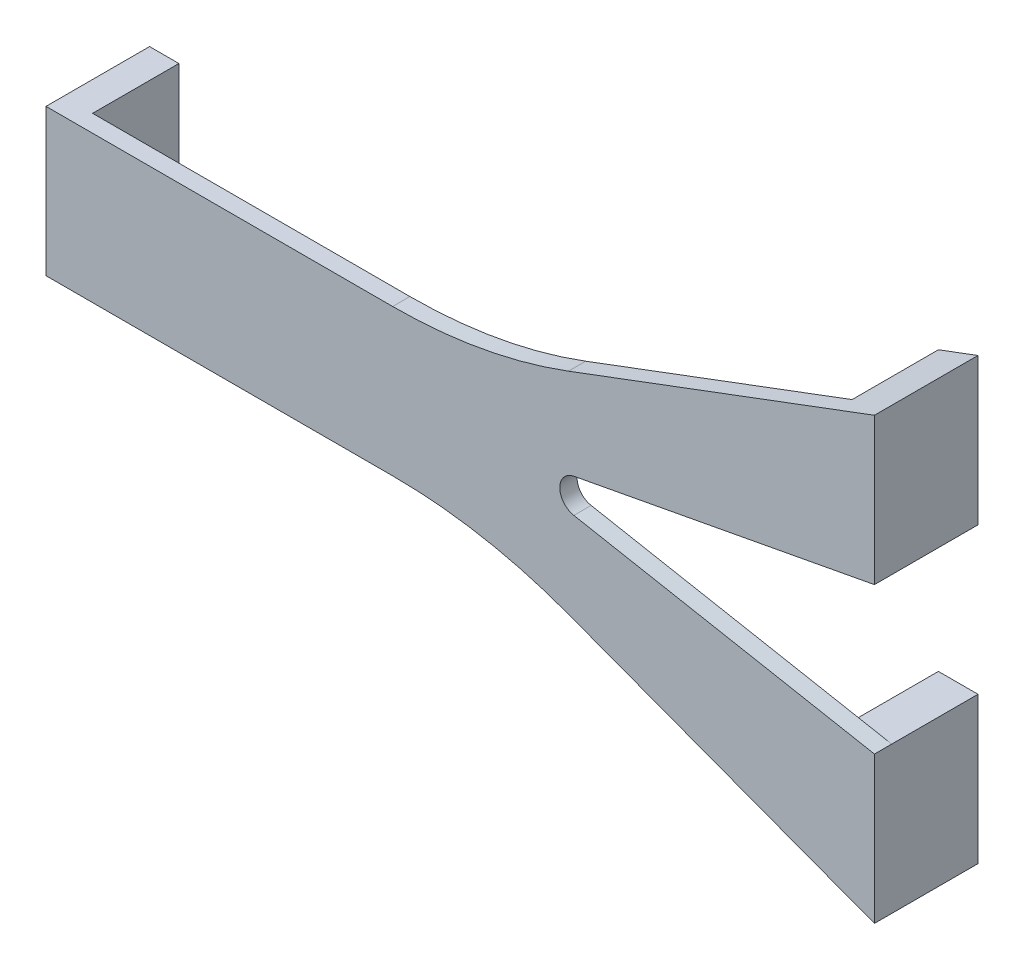
ISO-10303-21;
HEADER;
FILE_DESCRIPTION(('STEP AP214'),'2;1');
FILE_NAME('part.step','',(''),(''),'','','');
FILE_SCHEMA(('AUTOMOTIVE_DESIGN { 1 0 10303 214 1 1 1 1 }'));
ENDSEC;
DATA;
#1=APPLICATION_CONTEXT('core data for automotive mechanical design processes');
#2=APPLICATION_PROTOCOL_DEFINITION('international standard','automotive_design',2000,#1);
#3=PRODUCT_CONTEXT('',#1,'mechanical');
#4=PRODUCT('Part','Part','',(#3));
#5=PRODUCT_RELATED_PRODUCT_CATEGORY('part','',(#4));
#6=PRODUCT_DEFINITION_FORMATION('','',#4);
#7=PRODUCT_DEFINITION_CONTEXT('part definition',#1,'design');
#8=PRODUCT_DEFINITION('design','',#6,#7);
#9=PRODUCT_DEFINITION_SHAPE('','',#8);
#10=(LENGTH_UNIT() NAMED_UNIT(*) SI_UNIT(.MILLI.,.METRE.));
#11=(NAMED_UNIT(*) PLANE_ANGLE_UNIT() SI_UNIT($,.RADIAN.));
#12=(NAMED_UNIT(*) SI_UNIT($,.STERADIAN.) SOLID_ANGLE_UNIT());
#13=UNCERTAINTY_MEASURE_WITH_UNIT(LENGTH_MEASURE(1.E-05),#10,'distance_accuracy_value','');
#14=(GEOMETRIC_REPRESENTATION_CONTEXT(3) GLOBAL_UNCERTAINTY_ASSIGNED_CONTEXT((#13)) GLOBAL_UNIT_ASSIGNED_CONTEXT((#10,
#11,#12)) REPRESENTATION_CONTEXT('',''));
#15=CARTESIAN_POINT('',(0.,0.,0.));
#16=DIRECTION('',(0.,0.,1.));
#17=DIRECTION('',(1.,0.,0.));
#18=AXIS2_PLACEMENT_3D('',#15,#16,#17);
#19=CARTESIAN_POINT('',(-20.8933870747499,-66.5,0.));
#20=DIRECTION('',(0.,0.,-1.));
#21=DIRECTION('',(-1.,0.,0.));
#22=AXIS2_PLACEMENT_3D('',#19,#20,#21);
#23=PLANE('',#22);
#24=DIRECTION('',(0.,1.,0.));
#25=VECTOR('',#24,1.);
#26=CARTESIAN_POINT('',(-57.6611599424503,-8.5,0.));
#27=LINE('',#26,#25);
#28=CARTESIAN_POINT('',(-57.6611599424503,-8.5,0.));
#29=VERTEX_POINT('',#28);
#30=CARTESIAN_POINT('',(-57.6611599424503,8.5,0.));
#31=VERTEX_POINT('',#30);
#32=EDGE_CURVE('E188',#29,#31,#27,.T.);
#33=ORIENTED_EDGE('',*,*,#32,.T.);
#34=DIRECTION('',(1.,0.,0.));
#35=VECTOR('',#34,1.);
#36=CARTESIAN_POINT('',(-61.0611599424503,8.5,0.));
#37=LINE('',#36,#35);
#38=CARTESIAN_POINT('',(-20.8933870747501,8.5,0.));
#39=VERTEX_POINT('',#38);
#40=EDGE_CURVE('E173',#31,#39,#37,.T.);
#41=ORIENTED_EDGE('',*,*,#40,.T.);
#42=CARTESIAN_POINT('',(-20.8933870747499,66.5,0.));
#43=DIRECTION('',(0.,0.,1.));
#44=DIRECTION('',(1.,0.,0.));
#45=AXIS2_PLACEMENT_3D('',#42,#43,#44);
#46=CIRCLE('',#45,58.);
#47=CARTESIAN_POINT('',(-0.518908087194254,12.1964033789137,0.));
#48=VERTEX_POINT('',#47);
#49=EDGE_CURVE('E185',#39,#48,#46,.T.);
#50=ORIENTED_EDGE('',*,*,#49,.T.);
#51=DIRECTION('',(0.93626890726011,0.351284120475094,0.));
#52=VECTOR('',#51,1.);
#53=CARTESIAN_POINT('',(-0.518908087194254,12.1964033789137,0.));
#54=LINE('',#53,#52);
#55=CARTESIAN_POINT('',(30.3488400575497,23.7778514799779,0.));
#56=VERTEX_POINT('',#55);
#57=EDGE_CURVE('E339',#48,#56,#54,.T.);
#58=ORIENTED_EDGE('',*,*,#57,.T.);
#59=DIRECTION('',(0.,-1.,0.));
#60=VECTOR('',#59,1.);
#61=CARTESIAN_POINT('',(30.3488400575497,0.,0.));
#62=LINE('',#61,#60);
#63=CARTESIAN_POINT('',(30.3488400575497,8.5,0.));
#64=VERTEX_POINT('',#63);
#65=EDGE_CURVE('E233',#56,#64,#62,.T.);
#66=ORIENTED_EDGE('',*,*,#65,.T.);
#67=DIRECTION('',(-1.,0.,0.));
#68=VECTOR('',#67,1.);
#69=CARTESIAN_POINT('',(0.,8.5,0.));
#70=LINE('',#69,#68);
#71=CARTESIAN_POINT('',(34.9388400575497,8.5,0.));
#72=VERTEX_POINT('',#71);
#73=EDGE_CURVE('E252',#72,#64,#70,.T.);
#74=ORIENTED_EDGE('',*,*,#73,.F.);
#75=DIRECTION('',(0.982854757661242,0.184381466917534,0.));
#76=VECTOR('',#75,1.);
#77=CARTESIAN_POINT('',(0.107473336303987,1.96570951532252,0.));
#78=LINE('',#77,#76);
#79=CARTESIAN_POINT('',(0.107473336303987,1.96570951532252,0.));
#80=VERTEX_POINT('',#79);
#81=EDGE_CURVE('E335',#80,#72,#78,.T.);
#82=ORIENTED_EDGE('',*,*,#81,.F.);
#83=CARTESIAN_POINT('',(0.476236270138855,0.,0.));
#84=DIRECTION('',(0.,0.,-1.));
#85=DIRECTION('',(-1.,0.,0.));
#86=AXIS2_PLACEMENT_3D('',#83,#84,#85);
#87=CIRCLE('',#86,2.);
#88=CARTESIAN_POINT('',(0.107473336303987,-1.96570951532252,0.));
#89=VERTEX_POINT('',#88);
#90=EDGE_CURVE('E332',#89,#80,#87,.T.);
#91=ORIENTED_EDGE('',*,*,#90,.F.);
#92=DIRECTION('',(0.982854757661242,-0.184381466917534,0.));
#93=VECTOR('',#92,1.);
#94=CARTESIAN_POINT('',(0.107473336303987,-1.96570951532252,0.));
#95=LINE('',#94,#93);
#96=CARTESIAN_POINT('',(34.9388400575497,-8.5,0.));
#97=VERTEX_POINT('',#96);
#98=EDGE_CURVE('E329',#89,#97,#95,.T.);
#99=ORIENTED_EDGE('',*,*,#98,.T.);
#100=DIRECTION('',(-1.,0.,0.));
#101=VECTOR('',#100,1.);
#102=CARTESIAN_POINT('',(0.,-8.5,0.));
#103=LINE('',#102,#101);
#104=CARTESIAN_POINT('',(30.3488400575497,-8.5,0.));
#105=VERTEX_POINT('',#104);
#106=EDGE_CURVE('E64',#97,#105,#103,.T.);
#107=ORIENTED_EDGE('',*,*,#106,.T.);
#108=DIRECTION('',(0.,1.,0.));
#109=VECTOR('',#108,1.);
#110=CARTESIAN_POINT('',(30.3488400575497,0.,0.));
#111=LINE('',#110,#109);
#112=CARTESIAN_POINT('',(30.3488400575497,-23.7778514799779,0.));
#113=VERTEX_POINT('',#112);
#114=EDGE_CURVE('E228',#113,#105,#111,.T.);
#115=ORIENTED_EDGE('',*,*,#114,.F.);
#116=DIRECTION('',(0.93626890726011,-0.351284120475094,0.));
#117=VECTOR('',#116,1.);
#118=CARTESIAN_POINT('',(-0.518908087194254,-12.1964033789137,0.));
#119=LINE('',#118,#117);
#120=CARTESIAN_POINT('',(-0.51890808719425,-12.1964033789137,0.));
#121=VERTEX_POINT('',#120);
#122=EDGE_CURVE('E325',#121,#113,#119,.T.);
#123=ORIENTED_EDGE('',*,*,#122,.F.);
#124=CARTESIAN_POINT('',(-20.8933870747499,-66.5,0.));
#125=DIRECTION('',(0.,0.,-1.));
#126=DIRECTION('',(-1.,0.,0.));
#127=AXIS2_PLACEMENT_3D('',#124,#125,#126);
#128=CIRCLE('',#127,58.);
#129=CARTESIAN_POINT('',(-20.8933870747501,-8.5,0.));
#130=VERTEX_POINT('',#129);
#131=EDGE_CURVE('E322',#130,#121,#128,.T.);
#132=ORIENTED_EDGE('',*,*,#131,.F.);
#133=DIRECTION('',(1.,0.,0.));
#134=VECTOR('',#133,1.);
#135=CARTESIAN_POINT('',(-61.0611599424503,-8.5,0.));
#136=LINE('',#135,#134);
#137=EDGE_CURVE('E57',#29,#130,#136,.T.);
#138=ORIENTED_EDGE('',*,*,#137,.F.);
#139=EDGE_LOOP('',(#33,#41,#50,#58,#66,#74,#82,#91,#99,#107,#115,#123,#132,#138));
#140=FACE_BOUND('',#139,.T.);
#141=ADVANCED_FACE('F41',(#140),#23,.T.);
#142=CARTESIAN_POINT('',(-61.0611599424503,8.5,2.));
#143=DIRECTION('',(1.,0.,0.));
#144=DIRECTION('',(0.,0.,-1.));
#145=AXIS2_PLACEMENT_3D('',#142,#143,#144);
#146=PLANE('',#145);
#147=DIRECTION('',(0.,0.,-1.));
#148=VECTOR('',#147,1.);
#149=CARTESIAN_POINT('',(-61.0611599424503,8.5,2.));
#150=LINE('',#149,#148);
#151=CARTESIAN_POINT('',(-61.0611599424503,8.5,2.));
#152=VERTEX_POINT('',#151);
#153=CARTESIAN_POINT('',(-61.0611599424503,8.5,-10.));
#154=VERTEX_POINT('',#153);
#155=EDGE_CURVE('E319',#152,#154,#150,.T.);
#156=ORIENTED_EDGE('',*,*,#155,.T.);
#157=DIRECTION('',(0.,1.,0.));
#158=VECTOR('',#157,1.);
#159=CARTESIAN_POINT('',(-61.0611599424503,-8.5,-10.));
#160=LINE('',#159,#158);
#161=CARTESIAN_POINT('',(-61.0611599424503,-8.5,-10.));
#162=VERTEX_POINT('',#161);
#163=EDGE_CURVE('E201',#162,#154,#160,.T.);
#164=ORIENTED_EDGE('',*,*,#163,.F.);
#165=DIRECTION('',(0.,0.,-1.));
#166=VECTOR('',#165,1.);
#167=CARTESIAN_POINT('',(-61.0611599424503,-8.5,2.));
#168=LINE('',#167,#166);
#169=CARTESIAN_POINT('',(-61.0611599424503,-8.5,2.));
#170=VERTEX_POINT('',#169);
#171=EDGE_CURVE('E11',#170,#162,#168,.T.);
#172=ORIENTED_EDGE('',*,*,#171,.F.);
#173=DIRECTION('',(0.,-1.,0.));
#174=VECTOR('',#173,1.);
#175=CARTESIAN_POINT('',(-61.0611599424503,8.5,2.));
#176=LINE('',#175,#174);
#177=EDGE_CURVE('E184',#152,#170,#176,.T.);
#178=ORIENTED_EDGE('',*,*,#177,.F.);
#179=EDGE_LOOP('',(#156,#164,#172,#178));
#180=FACE_BOUND('',#179,.T.);
#181=ADVANCED_FACE('F43',(#180),#146,.F.);
#182=CARTESIAN_POINT('',(-61.0611599424503,-8.5,2.));
#183=DIRECTION('',(0.,1.,0.));
#184=DIRECTION('',(0.,0.,1.));
#185=AXIS2_PLACEMENT_3D('',#182,#183,#184);
#186=PLANE('',#185);
#187=ORIENTED_EDGE('',*,*,#171,.T.);
#188=DIRECTION('',(1.,0.,0.));
#189=VECTOR('',#188,1.);
#190=CARTESIAN_POINT('',(-61.0611599424503,-8.5,-10.));
#191=LINE('',#190,#189);
#192=CARTESIAN_POINT('',(-57.6611599424503,-8.5,-10.));
#193=VERTEX_POINT('',#192);
#194=EDGE_CURVE('E192',#162,#193,#191,.T.);
#195=ORIENTED_EDGE('',*,*,#194,.T.);
#196=DIRECTION('',(0.,0.,1.));
#197=VECTOR('',#196,1.);
#198=CARTESIAN_POINT('',(-57.6611599424503,-8.5,-10.));
#199=LINE('',#198,#197);
#200=EDGE_CURVE('E198',#193,#29,#199,.T.);
#201=ORIENTED_EDGE('',*,*,#200,.T.);
#202=ORIENTED_EDGE('',*,*,#137,.T.);
#203=DIRECTION('',(0.,0.,-1.));
#204=VECTOR('',#203,1.);
#205=CARTESIAN_POINT('',(-20.8933870747501,-8.5,2.));
#206=LINE('',#205,#204);
#207=CARTESIAN_POINT('',(-20.8933870747501,-8.5,2.));
#208=VERTEX_POINT('',#207);
#209=EDGE_CURVE('E50',#208,#130,#206,.T.);
#210=ORIENTED_EDGE('',*,*,#209,.F.);
#211=DIRECTION('',(1.,0.,0.));
#212=VECTOR('',#211,1.);
#213=CARTESIAN_POINT('',(-61.0611599424503,-8.5,2.));
#214=LINE('',#213,#212);
#215=EDGE_CURVE('E282',#170,#208,#214,.T.);
#216=ORIENTED_EDGE('',*,*,#215,.F.);
#217=EDGE_LOOP('',(#187,#195,#201,#202,#210,#216));
#218=FACE_BOUND('',#217,.T.);
#219=ADVANCED_FACE('F454',(#218),#186,.F.);
#220=CARTESIAN_POINT('',(-20.8933870747499,-66.5,2.));
#221=DIRECTION('',(0.,0.,-1.));
#222=DIRECTION('',(-1.,0.,0.));
#223=AXIS2_PLACEMENT_3D('',#220,#221,#222);
#224=CYLINDRICAL_SURFACE('',#223,58.);
#225=ORIENTED_EDGE('',*,*,#131,.T.);
#226=DIRECTION('',(0.,0.,-1.));
#227=VECTOR('',#226,1.);
#228=CARTESIAN_POINT('',(-0.51890808719425,-12.1964033789137,2.));
#229=LINE('',#228,#227);
#230=CARTESIAN_POINT('',(-0.51890808719425,-12.1964033789137,2.));
#231=VERTEX_POINT('',#230);
#232=EDGE_CURVE('E371',#231,#121,#229,.T.);
#233=ORIENTED_EDGE('',*,*,#232,.F.);
#234=CARTESIAN_POINT('',(-20.8933870747499,-66.5,2.));
#235=DIRECTION('',(0.,0.,-1.));
#236=DIRECTION('',(-1.,0.,0.));
#237=AXIS2_PLACEMENT_3D('',#234,#235,#236);
#238=CIRCLE('',#237,58.);
#239=EDGE_CURVE('E285',#208,#231,#238,.T.);
#240=ORIENTED_EDGE('',*,*,#239,.F.);
#241=ORIENTED_EDGE('',*,*,#209,.T.);
#242=EDGE_LOOP('',(#225,#233,#240,#241));
#243=FACE_BOUND('',#242,.T.);
#244=ADVANCED_FACE('F379',(#243),#224,.F.);
#245=CARTESIAN_POINT('',(-0.518908087194254,-12.1964033789137,2.));
#246=DIRECTION('',(0.351284120475094,0.93626890726011,0.));
#247=DIRECTION('',(-0.93626890726011,0.351284120475094,0.));
#248=AXIS2_PLACEMENT_3D('',#245,#246,#247);
#249=PLANE('',#248);
#250=ORIENTED_EDGE('',*,*,#122,.T.);
#251=DIRECTION('',(0.,0.,1.));
#252=VECTOR('',#251,1.);
#253=CARTESIAN_POINT('',(30.3488400575497,-23.7778514799779,-10.));
#254=LINE('',#253,#252);
#255=CARTESIAN_POINT('',(30.3488400575497,-23.7778514799779,-10.));
#256=VERTEX_POINT('',#255);
#257=EDGE_CURVE('E191',#256,#113,#254,.T.);
#258=ORIENTED_EDGE('',*,*,#257,.F.);
#259=DIRECTION('',(-0.93626890726011,0.351284120475094,0.));
#260=VECTOR('',#259,1.);
#261=CARTESIAN_POINT('',(-4.07538669426988,-10.862027699248,-10.));
#262=LINE('',#261,#260);
#263=CARTESIAN_POINT('',(34.9388400575497,-25.5,-10.));
#264=VERTEX_POINT('',#263);
#265=EDGE_CURVE('E229',#264,#256,#262,.T.);
#266=ORIENTED_EDGE('',*,*,#265,.F.);
#267=DIRECTION('',(0.,0.,-1.));
#268=VECTOR('',#267,1.);
#269=CARTESIAN_POINT('',(34.9388400575497,-25.5,2.));
#270=LINE('',#269,#268);
#271=CARTESIAN_POINT('',(34.9388400575497,-25.5,2.));
#272=VERTEX_POINT('',#271);
#273=EDGE_CURVE('E368',#272,#264,#270,.T.);
#274=ORIENTED_EDGE('',*,*,#273,.F.);
#275=DIRECTION('',(0.93626890726011,-0.351284120475094,0.));
#276=VECTOR('',#275,1.);
#277=CARTESIAN_POINT('',(-0.518908087194254,-12.1964033789137,2.));
#278=LINE('',#277,#276);
#279=EDGE_CURVE('E288',#231,#272,#278,.T.);
#280=ORIENTED_EDGE('',*,*,#279,.F.);
#281=ORIENTED_EDGE('',*,*,#232,.T.);
#282=EDGE_LOOP('',(#250,#258,#266,#274,#280,#281));
#283=FACE_BOUND('',#282,.T.);
#284=ADVANCED_FACE('F385',(#283),#249,.F.);
#285=CARTESIAN_POINT('',(34.9388400575497,-8.5,2.));
#286=DIRECTION('',(1.,0.,0.));
#287=DIRECTION('',(0.,0.,-1.));
#288=AXIS2_PLACEMENT_3D('',#285,#286,#287);
#289=PLANE('',#288);
#290=ORIENTED_EDGE('',*,*,#273,.T.);
#291=DIRECTION('',(0.,-1.,0.));
#292=VECTOR('',#291,1.);
#293=CARTESIAN_POINT('',(34.9388400575497,0.,-10.));
#294=LINE('',#293,#292);
#295=CARTESIAN_POINT('',(34.9388400575497,-8.5,-10.));
#296=VERTEX_POINT('',#295);
#297=EDGE_CURVE('E225',#296,#264,#294,.T.);
#298=ORIENTED_EDGE('',*,*,#297,.F.);
#299=DIRECTION('',(0.,0.,1.));
#300=VECTOR('',#299,1.);
#301=CARTESIAN_POINT('',(34.9388400575497,-8.5,-10.));
#302=LINE('',#301,#300);
#303=EDGE_CURVE('E221',#296,#97,#302,.T.);
#304=ORIENTED_EDGE('',*,*,#303,.T.);
#305=DIRECTION('',(0.,0.,-1.));
#306=VECTOR('',#305,1.);
#307=CARTESIAN_POINT('',(34.9388400575497,-8.5,2.));
#308=LINE('',#307,#306);
#309=CARTESIAN_POINT('',(34.9388400575497,-8.5,2.));
#310=VERTEX_POINT('',#309);
#311=EDGE_CURVE('E365',#310,#97,#308,.T.);
#312=ORIENTED_EDGE('',*,*,#311,.F.);
#313=DIRECTION('',(0.,-1.,0.));
#314=VECTOR('',#313,1.);
#315=CARTESIAN_POINT('',(34.9388400575497,-8.5,2.));
#316=LINE('',#315,#314);
#317=EDGE_CURVE('E291',#310,#272,#316,.T.);
#318=ORIENTED_EDGE('',*,*,#317,.T.);
#319=EDGE_LOOP('',(#290,#298,#304,#312,#318));
#320=FACE_BOUND('',#319,.T.);
#321=ADVANCED_FACE('F398',(#320),#289,.T.);
#322=CARTESIAN_POINT('',(0.107473336303987,-1.96570951532252,2.));
#323=DIRECTION('',(0.184381466917534,0.982854757661242,0.));
#324=DIRECTION('',(-0.982854757661242,0.184381466917534,0.));
#325=AXIS2_PLACEMENT_3D('',#322,#323,#324);
#326=PLANE('',#325);
#327=ORIENTED_EDGE('',*,*,#98,.F.);
#328=DIRECTION('',(0.,0.,-1.));
#329=VECTOR('',#328,1.);
#330=CARTESIAN_POINT('',(0.107473336303987,-1.96570951532252,2.));
#331=LINE('',#330,#329);
#332=CARTESIAN_POINT('',(0.107473336303987,-1.96570951532252,2.));
#333=VERTEX_POINT('',#332);
#334=EDGE_CURVE('E362',#333,#89,#331,.T.);
#335=ORIENTED_EDGE('',*,*,#334,.F.);
#336=DIRECTION('',(0.982854757661242,-0.184381466917534,0.));
#337=VECTOR('',#336,1.);
#338=CARTESIAN_POINT('',(0.107473336303987,-1.96570951532252,2.));
#339=LINE('',#338,#337);
#340=EDGE_CURVE('E295',#333,#310,#339,.T.);
#341=ORIENTED_EDGE('',*,*,#340,.T.);
#342=ORIENTED_EDGE('',*,*,#311,.T.);
#343=EDGE_LOOP('',(#327,#335,#341,#342));
#344=FACE_BOUND('',#343,.T.);
#345=ADVANCED_FACE('F404',(#344),#326,.T.);
#346=CARTESIAN_POINT('',(0.476236270138855,0.,2.));
#347=DIRECTION('',(0.,0.,-1.));
#348=DIRECTION('',(-1.,0.,0.));
#349=AXIS2_PLACEMENT_3D('',#346,#347,#348);
#350=CYLINDRICAL_SURFACE('',#349,2.);
#351=ORIENTED_EDGE('',*,*,#90,.T.);
#352=DIRECTION('',(0.,0.,-1.));
#353=VECTOR('',#352,1.);
#354=CARTESIAN_POINT('',(0.107473336303987,1.96570951532252,2.));
#355=LINE('',#354,#353);
#356=CARTESIAN_POINT('',(0.107473336303987,1.96570951532252,2.));
#357=VERTEX_POINT('',#356);
#358=EDGE_CURVE('E358',#357,#80,#355,.T.);
#359=ORIENTED_EDGE('',*,*,#358,.F.);
#360=CARTESIAN_POINT('',(0.476236270138855,0.,2.));
#361=DIRECTION('',(0.,0.,-1.));
#362=DIRECTION('',(-1.,0.,0.));
#363=AXIS2_PLACEMENT_3D('',#360,#361,#362);
#364=CIRCLE('',#363,2.);
#365=EDGE_CURVE('E299',#333,#357,#364,.T.);
#366=ORIENTED_EDGE('',*,*,#365,.F.);
#367=ORIENTED_EDGE('',*,*,#334,.T.);
#368=EDGE_LOOP('',(#351,#359,#366,#367));
#369=FACE_BOUND('',#368,.T.);
#370=ADVANCED_FACE('F409',(#369),#350,.F.);
#371=CARTESIAN_POINT('',(0.107473336303987,1.96570951532252,2.));
#372=DIRECTION('',(-0.184381466917534,0.982854757661242,0.));
#373=DIRECTION('',(-0.982854757661242,-0.184381466917534,0.));
#374=AXIS2_PLACEMENT_3D('',#371,#372,#373);
#375=PLANE('',#374);
#376=ORIENTED_EDGE('',*,*,#81,.T.);
#377=DIRECTION('',(0.,0.,-1.));
#378=VECTOR('',#377,1.);
#379=CARTESIAN_POINT('',(34.9388400575497,8.5,2.));
#380=LINE('',#379,#378);
#381=CARTESIAN_POINT('',(34.9388400575497,8.5,2.));
#382=VERTEX_POINT('',#381);
#383=EDGE_CURVE('E354',#382,#72,#380,.T.);
#384=ORIENTED_EDGE('',*,*,#383,.F.);
#385=DIRECTION('',(0.982854757661242,0.184381466917534,0.));
#386=VECTOR('',#385,1.);
#387=CARTESIAN_POINT('',(0.107473336303987,1.96570951532252,2.));
#388=LINE('',#387,#386);
#389=EDGE_CURVE('E302',#357,#382,#388,.T.);
#390=ORIENTED_EDGE('',*,*,#389,.F.);
#391=ORIENTED_EDGE('',*,*,#358,.T.);
#392=EDGE_LOOP('',(#376,#384,#390,#391));
#393=FACE_BOUND('',#392,.T.);
#394=ADVANCED_FACE('F416',(#393),#375,.F.);
#395=CARTESIAN_POINT('',(34.9388400575497,8.5,2.));
#396=DIRECTION('',(-1.,0.,0.));
#397=DIRECTION('',(0.,0.,1.));
#398=AXIS2_PLACEMENT_3D('',#395,#396,#397);
#399=PLANE('',#398);
#400=ORIENTED_EDGE('',*,*,#383,.T.);
#401=DIRECTION('',(0.,0.,1.));
#402=VECTOR('',#401,1.);
#403=CARTESIAN_POINT('',(34.9388400575497,8.5,-10.));
#404=LINE('',#403,#402);
#405=CARTESIAN_POINT('',(34.9388400575497,8.5,-10.));
#406=VERTEX_POINT('',#405);
#407=EDGE_CURVE('E271',#406,#72,#404,.T.);
#408=ORIENTED_EDGE('',*,*,#407,.F.);
#409=DIRECTION('',(0.,-1.,0.));
#410=VECTOR('',#409,1.);
#411=CARTESIAN_POINT('',(34.9388400575497,0.,-10.));
#412=LINE('',#411,#410);
#413=CARTESIAN_POINT('',(34.9388400575497,25.5,-10.));
#414=VERTEX_POINT('',#413);
#415=EDGE_CURVE('E256',#414,#406,#412,.T.);
#416=ORIENTED_EDGE('',*,*,#415,.F.);
#417=DIRECTION('',(0.,0.,-1.));
#418=VECTOR('',#417,1.);
#419=CARTESIAN_POINT('',(34.9388400575497,25.5,2.));
#420=LINE('',#419,#418);
#421=CARTESIAN_POINT('',(34.9388400575497,25.5,2.));
#422=VERTEX_POINT('',#421);
#423=EDGE_CURVE('E351',#422,#414,#420,.T.);
#424=ORIENTED_EDGE('',*,*,#423,.F.);
#425=DIRECTION('',(0.,1.,0.));
#426=VECTOR('',#425,1.);
#427=CARTESIAN_POINT('',(34.9388400575497,8.5,2.));
#428=LINE('',#427,#426);
#429=EDGE_CURVE('E305',#382,#422,#428,.T.);
#430=ORIENTED_EDGE('',*,*,#429,.F.);
#431=EDGE_LOOP('',(#400,#408,#416,#424,#430));
#432=FACE_BOUND('',#431,.T.);
#433=ADVANCED_FACE('F420',(#432),#399,.F.);
#434=CARTESIAN_POINT('',(-0.518908087194254,12.1964033789137,2.));
#435=DIRECTION('',(-0.351284120475094,0.93626890726011,0.));
#436=DIRECTION('',(-0.93626890726011,-0.351284120475094,0.));
#437=AXIS2_PLACEMENT_3D('',#434,#435,#436);
#438=PLANE('',#437);
#439=ORIENTED_EDGE('',*,*,#57,.F.);
#440=DIRECTION('',(0.,0.,-1.));
#441=VECTOR('',#440,1.);
#442=CARTESIAN_POINT('',(-0.518908087194254,12.1964033789137,2.));
#443=LINE('',#442,#441);
#444=CARTESIAN_POINT('',(-0.518908087194254,12.1964033789137,2.));
#445=VERTEX_POINT('',#444);
#446=EDGE_CURVE('E348',#445,#48,#443,.T.);
#447=ORIENTED_EDGE('',*,*,#446,.F.);
#448=DIRECTION('',(0.93626890726011,0.351284120475094,0.));
#449=VECTOR('',#448,1.);
#450=CARTESIAN_POINT('',(-0.518908087194254,12.1964033789137,2.));
#451=LINE('',#450,#449);
#452=EDGE_CURVE('E308',#445,#422,#451,.T.);
#453=ORIENTED_EDGE('',*,*,#452,.T.);
#454=ORIENTED_EDGE('',*,*,#423,.T.);
#455=DIRECTION('',(0.93626890726011,0.351284120475094,0.));
#456=VECTOR('',#455,1.);
#457=CARTESIAN_POINT('',(-4.07538669426988,10.862027699248,-10.));
#458=LINE('',#457,#456);
#459=CARTESIAN_POINT('',(30.3488400575497,23.7778514799779,-10.));
#460=VERTEX_POINT('',#459);
#461=EDGE_CURVE('E251',#460,#414,#458,.T.);
#462=ORIENTED_EDGE('',*,*,#461,.F.);
#463=DIRECTION('',(0.,0.,1.));
#464=VECTOR('',#463,1.);
#465=CARTESIAN_POINT('',(30.3488400575497,23.7778514799779,-10.));
#466=LINE('',#465,#464);
#467=EDGE_CURVE('E275',#460,#56,#466,.T.);
#468=ORIENTED_EDGE('',*,*,#467,.T.);
#469=EDGE_LOOP('',(#439,#447,#453,#454,#462,#468));
#470=FACE_BOUND('',#469,.T.);
#471=ADVANCED_FACE('F425',(#470),#438,.T.);
#472=CARTESIAN_POINT('',(-20.8933870747499,66.5,2.));
#473=DIRECTION('',(0.,0.,-1.));
#474=DIRECTION('',(-1.,0.,0.));
#475=AXIS2_PLACEMENT_3D('',#472,#473,#474);
#476=CYLINDRICAL_SURFACE('',#475,58.);
#477=ORIENTED_EDGE('',*,*,#49,.F.);
#478=DIRECTION('',(0.,0.,-1.));
#479=VECTOR('',#478,1.);
#480=CARTESIAN_POINT('',(-20.8933870747501,8.5,2.));
#481=LINE('',#480,#479);
#482=CARTESIAN_POINT('',(-20.8933870747501,8.5,2.));
#483=VERTEX_POINT('',#482);
#484=EDGE_CURVE('E180',#483,#39,#481,.T.);
#485=ORIENTED_EDGE('',*,*,#484,.F.);
#486=CARTESIAN_POINT('',(-20.8933870747499,66.5,2.));
#487=DIRECTION('',(0.,0.,1.));
#488=DIRECTION('',(1.,0.,0.));
#489=AXIS2_PLACEMENT_3D('',#486,#487,#488);
#490=CIRCLE('',#489,58.);
#491=EDGE_CURVE('E312',#483,#445,#490,.T.);
#492=ORIENTED_EDGE('',*,*,#491,.T.);
#493=ORIENTED_EDGE('',*,*,#446,.T.);
#494=EDGE_LOOP('',(#477,#485,#492,#493));
#495=FACE_BOUND('',#494,.T.);
#496=ADVANCED_FACE('F429',(#495),#476,.F.);
#497=CARTESIAN_POINT('',(-61.0611599424503,8.5,2.));
#498=DIRECTION('',(0.,1.,0.));
#499=DIRECTION('',(0.,0.,1.));
#500=AXIS2_PLACEMENT_3D('',#497,#498,#499);
#501=PLANE('',#500);
#502=ORIENTED_EDGE('',*,*,#40,.F.);
#503=DIRECTION('',(0.,0.,1.));
#504=VECTOR('',#503,1.);
#505=CARTESIAN_POINT('',(-57.6611599424503,8.5,-10.));
#506=LINE('',#505,#504);
#507=CARTESIAN_POINT('',(-57.6611599424503,8.5,-10.));
#508=VERTEX_POINT('',#507);
#509=EDGE_CURVE('E177',#508,#31,#506,.T.);
#510=ORIENTED_EDGE('',*,*,#509,.F.);
#511=DIRECTION('',(1.,0.,0.));
#512=VECTOR('',#511,1.);
#513=CARTESIAN_POINT('',(-61.0611599424503,8.5,-10.));
#514=LINE('',#513,#512);
#515=EDGE_CURVE('E207',#154,#508,#514,.T.);
#516=ORIENTED_EDGE('',*,*,#515,.F.);
#517=ORIENTED_EDGE('',*,*,#155,.F.);
#518=DIRECTION('',(1.,0.,0.));
#519=VECTOR('',#518,1.);
#520=CARTESIAN_POINT('',(-61.0611599424503,8.5,2.));
#521=LINE('',#520,#519);
#522=EDGE_CURVE('E316',#152,#483,#521,.T.);
#523=ORIENTED_EDGE('',*,*,#522,.T.);
#524=ORIENTED_EDGE('',*,*,#484,.T.);
#525=EDGE_LOOP('',(#502,#510,#516,#517,#523,#524));
#526=FACE_BOUND('',#525,.T.);
#527=ADVANCED_FACE('F174',(#526),#501,.T.);
#528=CARTESIAN_POINT('',(-20.8933870747499,-66.5,2.));
#529=DIRECTION('',(0.,0.,-1.));
#530=DIRECTION('',(-1.,0.,0.));
#531=AXIS2_PLACEMENT_3D('',#528,#529,#530);
#532=PLANE('',#531);
#533=ORIENTED_EDGE('',*,*,#177,.T.);
#534=ORIENTED_EDGE('',*,*,#215,.T.);
#535=ORIENTED_EDGE('',*,*,#239,.T.);
#536=ORIENTED_EDGE('',*,*,#279,.T.);
#537=ORIENTED_EDGE('',*,*,#317,.F.);
#538=ORIENTED_EDGE('',*,*,#340,.F.);
#539=ORIENTED_EDGE('',*,*,#365,.T.);
#540=ORIENTED_EDGE('',*,*,#389,.T.);
#541=ORIENTED_EDGE('',*,*,#429,.T.);
#542=ORIENTED_EDGE('',*,*,#452,.F.);
#543=ORIENTED_EDGE('',*,*,#491,.F.);
#544=ORIENTED_EDGE('',*,*,#522,.F.);
#545=EDGE_LOOP('',(#533,#534,#535,#536,#537,#538,#539,#540,#541,#542,#543,#544));
#546=FACE_BOUND('',#545,.T.);
#547=ADVANCED_FACE('F401',(#546),#532,.F.);
#548=CARTESIAN_POINT('',(30.3488400575497,0.,-10.));
#549=DIRECTION('',(-1.,0.,0.));
#550=DIRECTION('',(0.,0.,1.));
#551=AXIS2_PLACEMENT_3D('',#548,#549,#550);
#552=PLANE('',#551);
#553=ORIENTED_EDGE('',*,*,#65,.F.);
#554=ORIENTED_EDGE('',*,*,#467,.F.);
#555=DIRECTION('',(0.,-1.,0.));
#556=VECTOR('',#555,1.);
#557=CARTESIAN_POINT('',(30.3488400575497,0.,-10.));
#558=LINE('',#557,#556);
#559=CARTESIAN_POINT('',(30.3488400575497,8.5,-10.));
#560=VERTEX_POINT('',#559);
#561=EDGE_CURVE('E247',#460,#560,#558,.T.);
#562=ORIENTED_EDGE('',*,*,#561,.T.);
#563=DIRECTION('',(0.,0.,1.));
#564=VECTOR('',#563,1.);
#565=CARTESIAN_POINT('',(30.3488400575497,8.5,-10.));
#566=LINE('',#565,#564);
#567=EDGE_CURVE('E262',#560,#64,#566,.T.);
#568=ORIENTED_EDGE('',*,*,#567,.T.);
#569=EDGE_LOOP('',(#553,#554,#562,#568));
#570=FACE_BOUND('',#569,.T.);
#571=ADVANCED_FACE('F433',(#570),#552,.T.);
#572=CARTESIAN_POINT('',(0.,8.5,-10.));
#573=DIRECTION('',(0.,1.,0.));
#574=DIRECTION('',(0.,0.,1.));
#575=AXIS2_PLACEMENT_3D('',#572,#573,#574);
#576=PLANE('',#575);
#577=ORIENTED_EDGE('',*,*,#73,.T.);
#578=ORIENTED_EDGE('',*,*,#567,.F.);
#579=DIRECTION('',(-1.,0.,0.));
#580=VECTOR('',#579,1.);
#581=CARTESIAN_POINT('',(0.,8.5,-10.));
#582=LINE('',#581,#580);
#583=EDGE_CURVE('E259',#406,#560,#582,.T.);
#584=ORIENTED_EDGE('',*,*,#583,.F.);
#585=ORIENTED_EDGE('',*,*,#407,.T.);
#586=EDGE_LOOP('',(#577,#578,#584,#585));
#587=FACE_BOUND('',#586,.T.);
#588=ADVANCED_FACE('F437',(#587),#576,.F.);
#589=CARTESIAN_POINT('',(0.,0.,-10.));
#590=DIRECTION('',(0.,0.,-1.));
#591=DIRECTION('',(-1.,0.,0.));
#592=AXIS2_PLACEMENT_3D('',#589,#590,#591);
#593=PLANE('',#592);
#594=ORIENTED_EDGE('',*,*,#561,.F.);
#595=ORIENTED_EDGE('',*,*,#461,.T.);
#596=ORIENTED_EDGE('',*,*,#415,.T.);
#597=ORIENTED_EDGE('',*,*,#583,.T.);
#598=EDGE_LOOP('',(#594,#595,#596,#597));
#599=FACE_BOUND('',#598,.T.);
#600=ADVANCED_FACE('F447',(#599),#593,.T.);
#601=CARTESIAN_POINT('',(30.3488400575497,0.,-10.));
#602=DIRECTION('',(1.,0.,0.));
#603=DIRECTION('',(0.,0.,-1.));
#604=AXIS2_PLACEMENT_3D('',#601,#602,#603);
#605=PLANE('',#604);
#606=ORIENTED_EDGE('',*,*,#114,.T.);
#607=DIRECTION('',(0.,0.,1.));
#608=VECTOR('',#607,1.);
#609=CARTESIAN_POINT('',(30.3488400575497,-8.5,-10.));
#610=LINE('',#609,#608);
#611=CARTESIAN_POINT('',(30.3488400575497,-8.5,-10.));
#612=VERTEX_POINT('',#611);
#613=EDGE_CURVE('E218',#612,#105,#610,.T.);
#614=ORIENTED_EDGE('',*,*,#613,.F.);
#615=DIRECTION('',(0.,1.,0.));
#616=VECTOR('',#615,1.);
#617=CARTESIAN_POINT('',(30.3488400575497,0.,-10.));
#618=LINE('',#617,#616);
#619=EDGE_CURVE('E241',#256,#612,#618,.T.);
#620=ORIENTED_EDGE('',*,*,#619,.F.);
#621=ORIENTED_EDGE('',*,*,#257,.T.);
#622=EDGE_LOOP('',(#606,#614,#620,#621));
#623=FACE_BOUND('',#622,.T.);
#624=ADVANCED_FACE('F389',(#623),#605,.F.);
#625=CARTESIAN_POINT('',(0.,-8.5,-10.));
#626=DIRECTION('',(0.,1.,0.));
#627=DIRECTION('',(0.,0.,1.));
#628=AXIS2_PLACEMENT_3D('',#625,#626,#627);
#629=PLANE('',#628);
#630=ORIENTED_EDGE('',*,*,#106,.F.);
#631=ORIENTED_EDGE('',*,*,#303,.F.);
#632=DIRECTION('',(-1.,0.,0.));
#633=VECTOR('',#632,1.);
#634=CARTESIAN_POINT('',(0.,-8.5,-10.));
#635=LINE('',#634,#633);
#636=EDGE_CURVE('E237',#296,#612,#635,.T.);
#637=ORIENTED_EDGE('',*,*,#636,.T.);
#638=ORIENTED_EDGE('',*,*,#613,.T.);
#639=EDGE_LOOP('',(#630,#631,#637,#638));
#640=FACE_BOUND('',#639,.T.);
#641=ADVANCED_FACE('F439',(#640),#629,.T.);
#642=CARTESIAN_POINT('',(0.,0.,-10.));
#643=DIRECTION('',(0.,0.,-1.));
#644=DIRECTION('',(-1.,0.,0.));
#645=AXIS2_PLACEMENT_3D('',#642,#643,#644);
#646=PLANE('',#645);
#647=ORIENTED_EDGE('',*,*,#265,.T.);
#648=ORIENTED_EDGE('',*,*,#619,.T.);
#649=ORIENTED_EDGE('',*,*,#636,.F.);
#650=ORIENTED_EDGE('',*,*,#297,.T.);
#651=EDGE_LOOP('',(#647,#648,#649,#650));
#652=FACE_BOUND('',#651,.T.);
#653=ADVANCED_FACE('F393',(#652),#646,.T.);
#654=CARTESIAN_POINT('',(-57.6611599424503,-8.5,-10.));
#655=DIRECTION('',(1.,0.,0.));
#656=DIRECTION('',(0.,0.,-1.));
#657=AXIS2_PLACEMENT_3D('',#654,#655,#656);
#658=PLANE('',#657);
#659=ORIENTED_EDGE('',*,*,#32,.F.);
#660=ORIENTED_EDGE('',*,*,#200,.F.);
#661=DIRECTION('',(0.,1.,0.));
#662=VECTOR('',#661,1.);
#663=CARTESIAN_POINT('',(-57.6611599424503,-8.5,-10.));
#664=LINE('',#663,#662);
#665=EDGE_CURVE('E196',#193,#508,#664,.T.);
#666=ORIENTED_EDGE('',*,*,#665,.T.);
#667=ORIENTED_EDGE('',*,*,#509,.T.);
#668=EDGE_LOOP('',(#659,#660,#666,#667));
#669=FACE_BOUND('',#668,.T.);
#670=ADVANCED_FACE('F194',(#669),#658,.T.);
#671=CARTESIAN_POINT('',(0.,0.,-10.));
#672=DIRECTION('',(0.,0.,1.));
#673=DIRECTION('',(1.,0.,0.));
#674=AXIS2_PLACEMENT_3D('',#671,#672,#673);
#675=PLANE('',#674);
#676=ORIENTED_EDGE('',*,*,#194,.F.);
#677=ORIENTED_EDGE('',*,*,#163,.T.);
#678=ORIENTED_EDGE('',*,*,#515,.T.);
#679=ORIENTED_EDGE('',*,*,#665,.F.);
#680=EDGE_LOOP('',(#676,#677,#678,#679));
#681=FACE_BOUND('',#680,.T.);
#682=ADVANCED_FACE('F486',(#681),#675,.F.);
#683=CLOSED_SHELL('',(#141,#181,#219,#244,#284,#321,#345,#370,#394,#433,#471,#496,#527,#547,
#571,#588,#600,#624,#641,#653,#670,#682));
#684=MANIFOLD_SOLID_BREP('B2',#683);
#685=ADVANCED_BREP_SHAPE_REPRESENTATION('',(#18,#684),#14);
#686=SHAPE_DEFINITION_REPRESENTATION(#9,#685);
ENDSEC;
END-ISO-10303-21;
